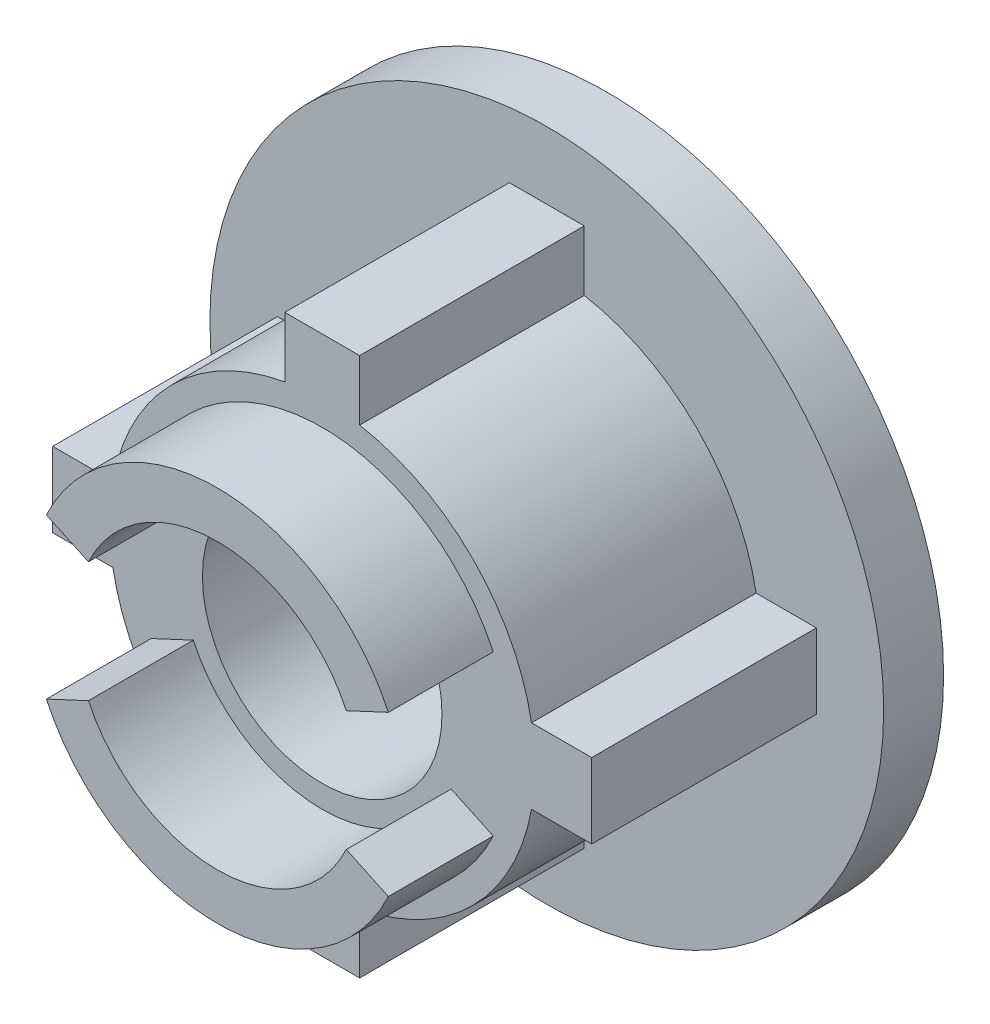
ISO-10303-21;
HEADER;
FILE_DESCRIPTION(('STEP AP214'),'2;1');
FILE_NAME('part.step','',(''),(''),'','','');
FILE_SCHEMA(('AUTOMOTIVE_DESIGN { 1 0 10303 214 1 1 1 1 }'));
ENDSEC;
DATA;
#1=APPLICATION_CONTEXT('core data for automotive mechanical design processes');
#2=APPLICATION_PROTOCOL_DEFINITION('international standard','automotive_design',2000,#1);
#3=PRODUCT_CONTEXT('',#1,'mechanical');
#4=PRODUCT('Part','Part','',(#3));
#5=PRODUCT_RELATED_PRODUCT_CATEGORY('part','',(#4));
#6=PRODUCT_DEFINITION_FORMATION('','',#4);
#7=PRODUCT_DEFINITION_CONTEXT('part definition',#1,'design');
#8=PRODUCT_DEFINITION('design','',#6,#7);
#9=PRODUCT_DEFINITION_SHAPE('','',#8);
#10=(LENGTH_UNIT() NAMED_UNIT(*) SI_UNIT(.MILLI.,.METRE.));
#11=(NAMED_UNIT(*) PLANE_ANGLE_UNIT() SI_UNIT($,.RADIAN.));
#12=(NAMED_UNIT(*) SI_UNIT($,.STERADIAN.) SOLID_ANGLE_UNIT());
#13=UNCERTAINTY_MEASURE_WITH_UNIT(LENGTH_MEASURE(1.E-05),#10,'distance_accuracy_value','');
#14=(GEOMETRIC_REPRESENTATION_CONTEXT(3) GLOBAL_UNCERTAINTY_ASSIGNED_CONTEXT((#13)) GLOBAL_UNIT_ASSIGNED_CONTEXT((#10,
#11,#12)) REPRESENTATION_CONTEXT('',''));
#15=CARTESIAN_POINT('',(0.,0.,0.));
#16=DIRECTION('',(0.,0.,1.));
#17=DIRECTION('',(1.,0.,0.));
#18=AXIS2_PLACEMENT_3D('',#15,#16,#17);
#19=CARTESIAN_POINT('',(0.,0.,15.));
#20=DIRECTION('',(0.,0.,1.));
#21=DIRECTION('',(1.,0.,0.));
#22=AXIS2_PLACEMENT_3D('',#19,#20,#21);
#23=PLANE('',#22);
#24=DIRECTION('',(0.,-1.,0.));
#25=VECTOR('',#24,1.);
#26=CARTESIAN_POINT('',(-2.50000000000001,0.,15.));
#27=LINE('',#26,#25);
#28=CARTESIAN_POINT('',(-2.50000000000001,18.,15.));
#29=VERTEX_POINT('',#28);
#30=CARTESIAN_POINT('',(-2.50000000000001,13.9781973086661,15.));
#31=VERTEX_POINT('',#30);
#32=EDGE_CURVE('E274',#29,#31,#27,.T.);
#33=ORIENTED_EDGE('',*,*,#32,.T.);
#34=CARTESIAN_POINT('',(0.,0.,15.));
#35=DIRECTION('',(0.,0.,1.));
#36=DIRECTION('',(1.,0.,0.));
#37=AXIS2_PLACEMENT_3D('',#34,#35,#36);
#38=CIRCLE('',#37,14.2);
#39=CARTESIAN_POINT('',(-13.9781973086661,2.49999999999995,15.));
#40=VERTEX_POINT('',#39);
#41=EDGE_CURVE('E277',#31,#40,#38,.T.);
#42=ORIENTED_EDGE('',*,*,#41,.T.);
#43=DIRECTION('',(-1.,0.,0.));
#44=VECTOR('',#43,1.);
#45=CARTESIAN_POINT('',(0.,2.49999999999995,15.));
#46=LINE('',#45,#44);
#47=CARTESIAN_POINT('',(-18.,2.49999999999995,15.));
#48=VERTEX_POINT('',#47);
#49=EDGE_CURVE('E280',#40,#48,#46,.T.);
#50=ORIENTED_EDGE('',*,*,#49,.T.);
#51=DIRECTION('',(0.,-1.,0.));
#52=VECTOR('',#51,1.);
#53=CARTESIAN_POINT('',(-18.,0.,15.));
#54=LINE('',#53,#52);
#55=CARTESIAN_POINT('',(-18.,-2.5,15.));
#56=VERTEX_POINT('',#55);
#57=EDGE_CURVE('E282',#48,#56,#54,.T.);
#58=ORIENTED_EDGE('',*,*,#57,.T.);
#59=DIRECTION('',(1.,0.,0.));
#60=VECTOR('',#59,1.);
#61=CARTESIAN_POINT('',(0.,-2.5,15.));
#62=LINE('',#61,#60);
#63=CARTESIAN_POINT('',(-13.9781973086661,-2.5,15.));
#64=VERTEX_POINT('',#63);
#65=EDGE_CURVE('E284',#56,#64,#62,.T.);
#66=ORIENTED_EDGE('',*,*,#65,.T.);
#67=CARTESIAN_POINT('',(0.,0.,15.));
#68=DIRECTION('',(0.,0.,1.));
#69=DIRECTION('',(1.,0.,0.));
#70=AXIS2_PLACEMENT_3D('',#67,#68,#69);
#71=CIRCLE('',#70,14.2);
#72=CARTESIAN_POINT('',(-2.5,-13.9781973086661,15.));
#73=VERTEX_POINT('',#72);
#74=EDGE_CURVE('E286',#64,#73,#71,.T.);
#75=ORIENTED_EDGE('',*,*,#74,.T.);
#76=DIRECTION('',(0.,-1.,0.));
#77=VECTOR('',#76,1.);
#78=CARTESIAN_POINT('',(-2.5,0.,15.));
#79=LINE('',#78,#77);
#80=CARTESIAN_POINT('',(-2.5,-18.,15.));
#81=VERTEX_POINT('',#80);
#82=EDGE_CURVE('E288',#73,#81,#79,.T.);
#83=ORIENTED_EDGE('',*,*,#82,.T.);
#84=DIRECTION('',(1.,0.,0.));
#85=VECTOR('',#84,1.);
#86=CARTESIAN_POINT('',(0.,-18.,15.));
#87=LINE('',#86,#85);
#88=CARTESIAN_POINT('',(2.5,-18.,15.));
#89=VERTEX_POINT('',#88);
#90=EDGE_CURVE('E290',#81,#89,#87,.T.);
#91=ORIENTED_EDGE('',*,*,#90,.T.);
#92=DIRECTION('',(0.,1.,0.));
#93=VECTOR('',#92,1.);
#94=CARTESIAN_POINT('',(2.5,0.,15.));
#95=LINE('',#94,#93);
#96=CARTESIAN_POINT('',(2.5,-13.9781973086661,15.));
#97=VERTEX_POINT('',#96);
#98=EDGE_CURVE('E292',#89,#97,#95,.T.);
#99=ORIENTED_EDGE('',*,*,#98,.T.);
#100=CARTESIAN_POINT('',(0.,0.,15.));
#101=DIRECTION('',(0.,0.,1.));
#102=DIRECTION('',(1.,0.,0.));
#103=AXIS2_PLACEMENT_3D('',#100,#101,#102);
#104=CIRCLE('',#103,14.2);
#105=CARTESIAN_POINT('',(13.9781973086661,-2.49999999999995,15.));
#106=VERTEX_POINT('',#105);
#107=EDGE_CURVE('E294',#97,#106,#104,.T.);
#108=ORIENTED_EDGE('',*,*,#107,.T.);
#109=DIRECTION('',(1.,0.,0.));
#110=VECTOR('',#109,1.);
#111=CARTESIAN_POINT('',(0.,-2.49999999999995,15.));
#112=LINE('',#111,#110);
#113=CARTESIAN_POINT('',(18.,-2.49999999999995,15.));
#114=VERTEX_POINT('',#113);
#115=EDGE_CURVE('E296',#106,#114,#112,.T.);
#116=ORIENTED_EDGE('',*,*,#115,.T.);
#117=DIRECTION('',(0.,1.,0.));
#118=VECTOR('',#117,1.);
#119=CARTESIAN_POINT('',(18.,0.,15.));
#120=LINE('',#119,#118);
#121=CARTESIAN_POINT('',(18.,2.5,15.));
#122=VERTEX_POINT('',#121);
#123=EDGE_CURVE('E298',#114,#122,#120,.T.);
#124=ORIENTED_EDGE('',*,*,#123,.T.);
#125=DIRECTION('',(-1.,0.,0.));
#126=VECTOR('',#125,1.);
#127=CARTESIAN_POINT('',(0.,2.5,15.));
#128=LINE('',#127,#126);
#129=CARTESIAN_POINT('',(13.9781973086661,2.5,15.));
#130=VERTEX_POINT('',#129);
#131=EDGE_CURVE('E300',#122,#130,#128,.T.);
#132=ORIENTED_EDGE('',*,*,#131,.T.);
#133=CARTESIAN_POINT('',(0.,0.,15.));
#134=DIRECTION('',(0.,0.,1.));
#135=DIRECTION('',(1.,0.,0.));
#136=AXIS2_PLACEMENT_3D('',#133,#134,#135);
#137=CIRCLE('',#136,14.2);
#138=CARTESIAN_POINT('',(2.5,13.9781973086661,15.));
#139=VERTEX_POINT('',#138);
#140=EDGE_CURVE('E302',#130,#139,#137,.T.);
#141=ORIENTED_EDGE('',*,*,#140,.T.);
#142=DIRECTION('',(0.,1.,0.));
#143=VECTOR('',#142,1.);
#144=CARTESIAN_POINT('',(2.5,0.,15.));
#145=LINE('',#144,#143);
#146=CARTESIAN_POINT('',(2.5,18.,15.));
#147=VERTEX_POINT('',#146);
#148=EDGE_CURVE('E304',#139,#147,#145,.T.);
#149=ORIENTED_EDGE('',*,*,#148,.T.);
#150=DIRECTION('',(-1.,0.,0.));
#151=VECTOR('',#150,1.);
#152=CARTESIAN_POINT('',(0.,18.,15.));
#153=LINE('',#152,#151);
#154=EDGE_CURVE('E306',#147,#29,#153,.T.);
#155=ORIENTED_EDGE('',*,*,#154,.T.);
#156=EDGE_LOOP('',(#33,#42,#50,#58,#66,#75,#83,#91,#99,#108,#116,#124,#132,#141,#149,#155));
#157=FACE_BOUND('',#156,.T.);
#158=CARTESIAN_POINT('',(0.,0.,15.));
#159=DIRECTION('',(0.,0.,1.));
#160=DIRECTION('',(1.,0.,0.));
#161=AXIS2_PLACEMENT_3D('',#158,#159,#160);
#162=CIRCLE('',#161,8.);
#163=CARTESIAN_POINT('',(8.,0.,15.));
#164=VERTEX_POINT('',#163);
#165=EDGE_CURVE('E239',#164,#164,#162,.T.);
#166=ORIENTED_EDGE('',*,*,#165,.F.);
#167=EDGE_LOOP('',(#166));
#168=FACE_BOUND('',#167,.T.);
#169=DIRECTION('',(0.906307787036649,0.422618261740701,0.));
#170=VECTOR('',#169,1.);
#171=CARTESIAN_POINT('',(8.60992397684817,4.01487348653666,15.));
#172=LINE('',#171,#170);
#173=CARTESIAN_POINT('',(8.60992397684817,4.01487348653666,15.));
#174=VERTEX_POINT('',#173);
#175=CARTESIAN_POINT('',(11.4194781166618,5.32499009793283,15.));
#176=VERTEX_POINT('',#175);
#177=EDGE_CURVE('E259',#174,#176,#172,.T.);
#178=ORIENTED_EDGE('',*,*,#177,.F.);
#179=CARTESIAN_POINT('',(0.,0.,15.));
#180=DIRECTION('',(0.,0.,-1.));
#181=DIRECTION('',(1.,0.,0.));
#182=AXIS2_PLACEMENT_3D('',#179,#180,#181);
#183=CIRCLE('',#182,9.5);
#184=CARTESIAN_POINT('',(-8.60992397684817,4.01487348653666,15.));
#185=VERTEX_POINT('',#184);
#186=EDGE_CURVE('E261',#185,#174,#183,.T.);
#187=ORIENTED_EDGE('',*,*,#186,.F.);
#188=DIRECTION('',(0.906307787036649,-0.4226182617407,0.));
#189=VECTOR('',#188,1.);
#190=CARTESIAN_POINT('',(-11.4194781166618,5.32499009793283,15.));
#191=LINE('',#190,#189);
#192=CARTESIAN_POINT('',(-11.4194781166618,5.32499009793283,15.));
#193=VERTEX_POINT('',#192);
#194=EDGE_CURVE('E254',#193,#185,#191,.T.);
#195=ORIENTED_EDGE('',*,*,#194,.F.);
#196=CARTESIAN_POINT('',(0.,0.,15.));
#197=DIRECTION('',(0.,0.,1.));
#198=DIRECTION('',(1.,0.,0.));
#199=AXIS2_PLACEMENT_3D('',#196,#197,#198);
#200=CIRCLE('',#199,12.6);
#201=EDGE_CURVE('E256',#176,#193,#200,.T.);
#202=ORIENTED_EDGE('',*,*,#201,.F.);
#203=EDGE_LOOP('',(#178,#187,#195,#202));
#204=FACE_BOUND('',#203,.T.);
#205=DIRECTION('',(-0.906307787036649,0.422618261740701,0.));
#206=VECTOR('',#205,1.);
#207=CARTESIAN_POINT('',(8.60992397684817,-4.01487348653666,15.));
#208=LINE('',#207,#206);
#209=CARTESIAN_POINT('',(11.4194781166618,-5.32499009793283,15.));
#210=VERTEX_POINT('',#209);
#211=CARTESIAN_POINT('',(8.60992397684817,-4.01487348653666,15.));
#212=VERTEX_POINT('',#211);
#213=EDGE_CURVE('E710',#210,#212,#208,.T.);
#214=ORIENTED_EDGE('',*,*,#213,.F.);
#215=CARTESIAN_POINT('',(0.,0.,15.));
#216=DIRECTION('',(0.,0.,1.));
#217=DIRECTION('',(1.,0.,0.));
#218=AXIS2_PLACEMENT_3D('',#215,#216,#217);
#219=CIRCLE('',#218,12.6);
#220=CARTESIAN_POINT('',(-11.4194781166618,-5.32499009793283,15.));
#221=VERTEX_POINT('',#220);
#222=EDGE_CURVE('E234',#221,#210,#219,.T.);
#223=ORIENTED_EDGE('',*,*,#222,.F.);
#224=DIRECTION('',(-0.906307787036649,-0.422618261740701,0.));
#225=VECTOR('',#224,1.);
#226=CARTESIAN_POINT('',(-11.4194781166618,-5.32499009793283,15.));
#227=LINE('',#226,#225);
#228=CARTESIAN_POINT('',(-8.60992397684817,-4.01487348653666,15.));
#229=VERTEX_POINT('',#228);
#230=EDGE_CURVE('E230',#229,#221,#227,.T.);
#231=ORIENTED_EDGE('',*,*,#230,.F.);
#232=CARTESIAN_POINT('',(0.,0.,15.));
#233=DIRECTION('',(0.,0.,-1.));
#234=DIRECTION('',(1.,0.,0.));
#235=AXIS2_PLACEMENT_3D('',#232,#233,#234);
#236=CIRCLE('',#235,9.5);
#237=EDGE_CURVE('E707',#212,#229,#236,.T.);
#238=ORIENTED_EDGE('',*,*,#237,.F.);
#239=EDGE_LOOP('',(#214,#223,#231,#238));
#240=FACE_BOUND('',#239,.T.);
#241=ADVANCED_FACE('F49',(#157,#168,#204,#240),#23,.T.);
#242=CARTESIAN_POINT('',(0.,0.,0.));
#243=DIRECTION('',(0.,0.,-1.));
#244=DIRECTION('',(-1.,0.,0.));
#245=AXIS2_PLACEMENT_3D('',#242,#243,#244);
#246=PLANE('',#245);
#247=CARTESIAN_POINT('',(0.,0.,0.));
#248=DIRECTION('',(0.,0.,-1.));
#249=DIRECTION('',(-1.,0.,0.));
#250=AXIS2_PLACEMENT_3D('',#247,#248,#249);
#251=CIRCLE('',#250,22.5);
#252=CARTESIAN_POINT('',(-22.5,0.,0.));
#253=VERTEX_POINT('',#252);
#254=EDGE_CURVE('E405',#253,#253,#251,.T.);
#255=ORIENTED_EDGE('',*,*,#254,.F.);
#256=EDGE_LOOP('',(#255));
#257=FACE_BOUND('',#256,.T.);
#258=DIRECTION('',(0.,-1.,0.));
#259=VECTOR('',#258,1.);
#260=CARTESIAN_POINT('',(-2.50000000000001,0.,0.));
#261=LINE('',#260,#259);
#262=CARTESIAN_POINT('',(-2.50000000000001,18.,0.));
#263=VERTEX_POINT('',#262);
#264=CARTESIAN_POINT('',(-2.50000000000001,13.9781973086661,0.));
#265=VERTEX_POINT('',#264);
#266=EDGE_CURVE('E273',#263,#265,#261,.T.);
#267=ORIENTED_EDGE('',*,*,#266,.F.);
#268=DIRECTION('',(-1.,0.,0.));
#269=VECTOR('',#268,1.);
#270=CARTESIAN_POINT('',(0.,18.,0.));
#271=LINE('',#270,#269);
#272=CARTESIAN_POINT('',(2.5,18.,0.));
#273=VERTEX_POINT('',#272);
#274=EDGE_CURVE('E278',#273,#263,#271,.T.);
#275=ORIENTED_EDGE('',*,*,#274,.F.);
#276=DIRECTION('',(0.,1.,0.));
#277=VECTOR('',#276,1.);
#278=CARTESIAN_POINT('',(2.5,0.,0.));
#279=LINE('',#278,#277);
#280=CARTESIAN_POINT('',(2.5,13.9781973086661,0.));
#281=VERTEX_POINT('',#280);
#282=EDGE_CURVE('E350',#281,#273,#279,.T.);
#283=ORIENTED_EDGE('',*,*,#282,.F.);
#284=CARTESIAN_POINT('',(0.,0.,0.));
#285=DIRECTION('',(0.,0.,1.));
#286=DIRECTION('',(1.,0.,0.));
#287=AXIS2_PLACEMENT_3D('',#284,#285,#286);
#288=CIRCLE('',#287,14.2);
#289=CARTESIAN_POINT('',(13.9781973086661,2.5,0.));
#290=VERTEX_POINT('',#289);
#291=EDGE_CURVE('E347',#290,#281,#288,.T.);
#292=ORIENTED_EDGE('',*,*,#291,.F.);
#293=DIRECTION('',(-1.,0.,0.));
#294=VECTOR('',#293,1.);
#295=CARTESIAN_POINT('',(0.,2.5,0.));
#296=LINE('',#295,#294);
#297=CARTESIAN_POINT('',(18.,2.5,0.));
#298=VERTEX_POINT('',#297);
#299=EDGE_CURVE('E344',#298,#290,#296,.T.);
#300=ORIENTED_EDGE('',*,*,#299,.F.);
#301=DIRECTION('',(0.,1.,0.));
#302=VECTOR('',#301,1.);
#303=CARTESIAN_POINT('',(18.,0.,0.));
#304=LINE('',#303,#302);
#305=CARTESIAN_POINT('',(18.,-2.49999999999995,0.));
#306=VERTEX_POINT('',#305);
#307=EDGE_CURVE('E341',#306,#298,#304,.T.);
#308=ORIENTED_EDGE('',*,*,#307,.F.);
#309=DIRECTION('',(1.,0.,0.));
#310=VECTOR('',#309,1.);
#311=CARTESIAN_POINT('',(0.,-2.49999999999995,0.));
#312=LINE('',#311,#310);
#313=CARTESIAN_POINT('',(13.9781973086661,-2.49999999999995,0.));
#314=VERTEX_POINT('',#313);
#315=EDGE_CURVE('E338',#314,#306,#312,.T.);
#316=ORIENTED_EDGE('',*,*,#315,.F.);
#317=CARTESIAN_POINT('',(0.,0.,0.));
#318=DIRECTION('',(0.,0.,1.));
#319=DIRECTION('',(1.,0.,0.));
#320=AXIS2_PLACEMENT_3D('',#317,#318,#319);
#321=CIRCLE('',#320,14.2);
#322=CARTESIAN_POINT('',(2.5,-13.9781973086661,0.));
#323=VERTEX_POINT('',#322);
#324=EDGE_CURVE('E335',#323,#314,#321,.T.);
#325=ORIENTED_EDGE('',*,*,#324,.F.);
#326=DIRECTION('',(0.,1.,0.));
#327=VECTOR('',#326,1.);
#328=CARTESIAN_POINT('',(2.5,0.,0.));
#329=LINE('',#328,#327);
#330=CARTESIAN_POINT('',(2.5,-18.,0.));
#331=VERTEX_POINT('',#330);
#332=EDGE_CURVE('E332',#331,#323,#329,.T.);
#333=ORIENTED_EDGE('',*,*,#332,.F.);
#334=DIRECTION('',(1.,0.,0.));
#335=VECTOR('',#334,1.);
#336=CARTESIAN_POINT('',(0.,-18.,0.));
#337=LINE('',#336,#335);
#338=CARTESIAN_POINT('',(-2.5,-18.,0.));
#339=VERTEX_POINT('',#338);
#340=EDGE_CURVE('E329',#339,#331,#337,.T.);
#341=ORIENTED_EDGE('',*,*,#340,.F.);
#342=DIRECTION('',(0.,-1.,0.));
#343=VECTOR('',#342,1.);
#344=CARTESIAN_POINT('',(-2.5,0.,0.));
#345=LINE('',#344,#343);
#346=CARTESIAN_POINT('',(-2.5,-13.9781973086661,0.));
#347=VERTEX_POINT('',#346);
#348=EDGE_CURVE('E326',#347,#339,#345,.T.);
#349=ORIENTED_EDGE('',*,*,#348,.F.);
#350=CARTESIAN_POINT('',(0.,0.,0.));
#351=DIRECTION('',(0.,0.,1.));
#352=DIRECTION('',(1.,0.,0.));
#353=AXIS2_PLACEMENT_3D('',#350,#351,#352);
#354=CIRCLE('',#353,14.2);
#355=CARTESIAN_POINT('',(-13.9781973086661,-2.5,0.));
#356=VERTEX_POINT('',#355);
#357=EDGE_CURVE('E323',#356,#347,#354,.T.);
#358=ORIENTED_EDGE('',*,*,#357,.F.);
#359=DIRECTION('',(1.,0.,0.));
#360=VECTOR('',#359,1.);
#361=CARTESIAN_POINT('',(0.,-2.5,0.));
#362=LINE('',#361,#360);
#363=CARTESIAN_POINT('',(-18.,-2.5,0.));
#364=VERTEX_POINT('',#363);
#365=EDGE_CURVE('E320',#364,#356,#362,.T.);
#366=ORIENTED_EDGE('',*,*,#365,.F.);
#367=DIRECTION('',(0.,-1.,0.));
#368=VECTOR('',#367,1.);
#369=CARTESIAN_POINT('',(-18.,0.,0.));
#370=LINE('',#369,#368);
#371=CARTESIAN_POINT('',(-18.,2.49999999999995,0.));
#372=VERTEX_POINT('',#371);
#373=EDGE_CURVE('E317',#372,#364,#370,.T.);
#374=ORIENTED_EDGE('',*,*,#373,.F.);
#375=DIRECTION('',(-1.,0.,0.));
#376=VECTOR('',#375,1.);
#377=CARTESIAN_POINT('',(0.,2.49999999999995,0.));
#378=LINE('',#377,#376);
#379=CARTESIAN_POINT('',(-13.9781973086661,2.49999999999995,0.));
#380=VERTEX_POINT('',#379);
#381=EDGE_CURVE('E314',#380,#372,#378,.T.);
#382=ORIENTED_EDGE('',*,*,#381,.F.);
#383=CARTESIAN_POINT('',(0.,0.,0.));
#384=DIRECTION('',(0.,0.,1.));
#385=DIRECTION('',(1.,0.,0.));
#386=AXIS2_PLACEMENT_3D('',#383,#384,#385);
#387=CIRCLE('',#386,14.2);
#388=EDGE_CURVE('E311',#265,#380,#387,.T.);
#389=ORIENTED_EDGE('',*,*,#388,.F.);
#390=EDGE_LOOP('',(#267,#275,#283,#292,#300,#308,#316,#325,#333,#341,#349,#358,#366,#374,#382,#389));
#391=FACE_BOUND('',#390,.T.);
#392=ADVANCED_FACE('F411',(#257,#391),#246,.F.);
#393=CARTESIAN_POINT('',(0.,0.,-4.));
#394=DIRECTION('',(0.,0.,1.));
#395=DIRECTION('',(1.,0.,0.));
#396=AXIS2_PLACEMENT_3D('',#393,#394,#395);
#397=CYLINDRICAL_SURFACE('',#396,22.5);
#398=CARTESIAN_POINT('',(0.,0.,-4.));
#399=DIRECTION('',(0.,0.,-1.));
#400=DIRECTION('',(-1.,0.,0.));
#401=AXIS2_PLACEMENT_3D('',#398,#399,#400);
#402=CIRCLE('',#401,22.5);
#403=CARTESIAN_POINT('',(-22.5,0.,-4.));
#404=VERTEX_POINT('',#403);
#405=EDGE_CURVE('E57',#404,#404,#402,.T.);
#406=ORIENTED_EDGE('',*,*,#405,.F.);
#407=EDGE_LOOP('',(#406));
#408=FACE_BOUND('',#407,.T.);
#409=ORIENTED_EDGE('',*,*,#254,.T.);
#410=EDGE_LOOP('',(#409));
#411=FACE_BOUND('',#410,.T.);
#412=ADVANCED_FACE('F51',(#408,#411),#397,.T.);
#413=CARTESIAN_POINT('',(0.,0.,-4.));
#414=DIRECTION('',(0.,0.,-1.));
#415=DIRECTION('',(-1.,0.,0.));
#416=AXIS2_PLACEMENT_3D('',#413,#414,#415);
#417=PLANE('',#416);
#418=ORIENTED_EDGE('',*,*,#405,.T.);
#419=EDGE_LOOP('',(#418));
#420=FACE_BOUND('',#419,.T.);
#421=CARTESIAN_POINT('',(0.,0.,-4.));
#422=DIRECTION('',(0.,0.,-1.));
#423=DIRECTION('',(-1.,0.,0.));
#424=AXIS2_PLACEMENT_3D('',#421,#422,#423);
#425=CIRCLE('',#424,11.15);
#426=CARTESIAN_POINT('',(-11.15,0.,-4.));
#427=VERTEX_POINT('',#426);
#428=EDGE_CURVE('E402',#427,#427,#425,.T.);
#429=ORIENTED_EDGE('',*,*,#428,.F.);
#430=EDGE_LOOP('',(#429));
#431=FACE_BOUND('',#430,.T.);
#432=ADVANCED_FACE('F582',(#420,#431),#417,.T.);
#433=CARTESIAN_POINT('',(0.,0.,-44.1636651713959));
#434=DIRECTION('',(0.,0.,1.));
#435=DIRECTION('',(1.,0.,0.));
#436=AXIS2_PLACEMENT_3D('',#433,#434,#435);
#437=CYLINDRICAL_SURFACE('',#436,11.15);
#438=CARTESIAN_POINT('',(0.,0.,3.));
#439=DIRECTION('',(0.,0.,-1.));
#440=DIRECTION('',(-1.,0.,0.));
#441=AXIS2_PLACEMENT_3D('',#438,#439,#440);
#442=CIRCLE('',#441,11.15);
#443=CARTESIAN_POINT('',(-11.15,0.,3.));
#444=VERTEX_POINT('',#443);
#445=EDGE_CURVE('E11',#444,#444,#442,.T.);
#446=ORIENTED_EDGE('',*,*,#445,.F.);
#447=EDGE_LOOP('',(#446));
#448=FACE_BOUND('',#447,.T.);
#449=ORIENTED_EDGE('',*,*,#428,.T.);
#450=EDGE_LOOP('',(#449));
#451=FACE_BOUND('',#450,.T.);
#452=ADVANCED_FACE('F486',(#448,#451),#437,.F.);
#453=CARTESIAN_POINT('',(-2.50000000000001,0.,15.));
#454=DIRECTION('',(1.,0.,0.));
#455=DIRECTION('',(0.,0.,-1.));
#456=AXIS2_PLACEMENT_3D('',#453,#454,#455);
#457=PLANE('',#456);
#458=ORIENTED_EDGE('',*,*,#266,.T.);
#459=DIRECTION('',(0.,0.,-1.));
#460=VECTOR('',#459,1.);
#461=CARTESIAN_POINT('',(-2.50000000000001,13.9781973086661,15.));
#462=LINE('',#461,#460);
#463=EDGE_CURVE('E399',#31,#265,#462,.T.);
#464=ORIENTED_EDGE('',*,*,#463,.F.);
#465=ORIENTED_EDGE('',*,*,#32,.F.);
#466=DIRECTION('',(0.,0.,-1.));
#467=VECTOR('',#466,1.);
#468=CARTESIAN_POINT('',(-2.50000000000001,18.,15.));
#469=LINE('',#468,#467);
#470=EDGE_CURVE('E308',#29,#263,#469,.T.);
#471=ORIENTED_EDGE('',*,*,#470,.T.);
#472=EDGE_LOOP('',(#458,#464,#465,#471));
#473=FACE_BOUND('',#472,.T.);
#474=ADVANCED_FACE('F422',(#473),#457,.F.);
#475=CARTESIAN_POINT('',(0.,0.,15.));
#476=DIRECTION('',(0.,0.,-1.));
#477=DIRECTION('',(-1.,0.,0.));
#478=AXIS2_PLACEMENT_3D('',#475,#476,#477);
#479=CYLINDRICAL_SURFACE('',#478,14.2);
#480=ORIENTED_EDGE('',*,*,#388,.T.);
#481=DIRECTION('',(0.,0.,-1.));
#482=VECTOR('',#481,1.);
#483=CARTESIAN_POINT('',(-13.9781973086661,2.49999999999995,15.));
#484=LINE('',#483,#482);
#485=EDGE_CURVE('E396',#40,#380,#484,.T.);
#486=ORIENTED_EDGE('',*,*,#485,.F.);
#487=ORIENTED_EDGE('',*,*,#41,.F.);
#488=ORIENTED_EDGE('',*,*,#463,.T.);
#489=EDGE_LOOP('',(#480,#486,#487,#488));
#490=FACE_BOUND('',#489,.T.);
#491=ADVANCED_FACE('F478',(#490),#479,.T.);
#492=CARTESIAN_POINT('',(0.,2.49999999999995,15.));
#493=DIRECTION('',(0.,-1.,0.));
#494=DIRECTION('',(0.,0.,-1.));
#495=AXIS2_PLACEMENT_3D('',#492,#493,#494);
#496=PLANE('',#495);
#497=ORIENTED_EDGE('',*,*,#381,.T.);
#498=DIRECTION('',(0.,0.,-1.));
#499=VECTOR('',#498,1.);
#500=CARTESIAN_POINT('',(-18.,2.49999999999995,15.));
#501=LINE('',#500,#499);
#502=EDGE_CURVE('E393',#48,#372,#501,.T.);
#503=ORIENTED_EDGE('',*,*,#502,.F.);
#504=ORIENTED_EDGE('',*,*,#49,.F.);
#505=ORIENTED_EDGE('',*,*,#485,.T.);
#506=EDGE_LOOP('',(#497,#503,#504,#505));
#507=FACE_BOUND('',#506,.T.);
#508=ADVANCED_FACE('F476',(#507),#496,.F.);
#509=CARTESIAN_POINT('',(-18.,0.,15.));
#510=DIRECTION('',(1.,0.,0.));
#511=DIRECTION('',(0.,0.,-1.));
#512=AXIS2_PLACEMENT_3D('',#509,#510,#511);
#513=PLANE('',#512);
#514=ORIENTED_EDGE('',*,*,#373,.T.);
#515=DIRECTION('',(0.,0.,-1.));
#516=VECTOR('',#515,1.);
#517=CARTESIAN_POINT('',(-18.,-2.5,15.));
#518=LINE('',#517,#516);
#519=EDGE_CURVE('E390',#56,#364,#518,.T.);
#520=ORIENTED_EDGE('',*,*,#519,.F.);
#521=ORIENTED_EDGE('',*,*,#57,.F.);
#522=ORIENTED_EDGE('',*,*,#502,.T.);
#523=EDGE_LOOP('',(#514,#520,#521,#522));
#524=FACE_BOUND('',#523,.T.);
#525=ADVANCED_FACE('F471',(#524),#513,.F.);
#526=CARTESIAN_POINT('',(0.,-2.5,15.));
#527=DIRECTION('',(0.,1.,0.));
#528=DIRECTION('',(0.,0.,1.));
#529=AXIS2_PLACEMENT_3D('',#526,#527,#528);
#530=PLANE('',#529);
#531=ORIENTED_EDGE('',*,*,#365,.T.);
#532=DIRECTION('',(0.,0.,-1.));
#533=VECTOR('',#532,1.);
#534=CARTESIAN_POINT('',(-13.9781973086661,-2.5,15.));
#535=LINE('',#534,#533);
#536=EDGE_CURVE('E387',#64,#356,#535,.T.);
#537=ORIENTED_EDGE('',*,*,#536,.F.);
#538=ORIENTED_EDGE('',*,*,#65,.F.);
#539=ORIENTED_EDGE('',*,*,#519,.T.);
#540=EDGE_LOOP('',(#531,#537,#538,#539));
#541=FACE_BOUND('',#540,.T.);
#542=ADVANCED_FACE('F468',(#541),#530,.F.);
#543=CARTESIAN_POINT('',(0.,0.,15.));
#544=DIRECTION('',(0.,0.,-1.));
#545=DIRECTION('',(-1.,0.,0.));
#546=AXIS2_PLACEMENT_3D('',#543,#544,#545);
#547=CYLINDRICAL_SURFACE('',#546,14.2);
#548=ORIENTED_EDGE('',*,*,#357,.T.);
#549=DIRECTION('',(0.,0.,-1.));
#550=VECTOR('',#549,1.);
#551=CARTESIAN_POINT('',(-2.5,-13.9781973086661,15.));
#552=LINE('',#551,#550);
#553=EDGE_CURVE('E384',#73,#347,#552,.T.);
#554=ORIENTED_EDGE('',*,*,#553,.F.);
#555=ORIENTED_EDGE('',*,*,#74,.F.);
#556=ORIENTED_EDGE('',*,*,#536,.T.);
#557=EDGE_LOOP('',(#548,#554,#555,#556));
#558=FACE_BOUND('',#557,.T.);
#559=ADVANCED_FACE('F463',(#558),#547,.T.);
#560=CARTESIAN_POINT('',(-2.5,0.,15.));
#561=DIRECTION('',(1.,0.,0.));
#562=DIRECTION('',(0.,0.,-1.));
#563=AXIS2_PLACEMENT_3D('',#560,#561,#562);
#564=PLANE('',#563);
#565=ORIENTED_EDGE('',*,*,#348,.T.);
#566=DIRECTION('',(0.,0.,-1.));
#567=VECTOR('',#566,1.);
#568=CARTESIAN_POINT('',(-2.5,-18.,15.));
#569=LINE('',#568,#567);
#570=EDGE_CURVE('E381',#81,#339,#569,.T.);
#571=ORIENTED_EDGE('',*,*,#570,.F.);
#572=ORIENTED_EDGE('',*,*,#82,.F.);
#573=ORIENTED_EDGE('',*,*,#553,.T.);
#574=EDGE_LOOP('',(#565,#571,#572,#573));
#575=FACE_BOUND('',#574,.T.);
#576=ADVANCED_FACE('F460',(#575),#564,.F.);
#577=CARTESIAN_POINT('',(0.,-18.,15.));
#578=DIRECTION('',(0.,1.,0.));
#579=DIRECTION('',(0.,0.,1.));
#580=AXIS2_PLACEMENT_3D('',#577,#578,#579);
#581=PLANE('',#580);
#582=ORIENTED_EDGE('',*,*,#340,.T.);
#583=DIRECTION('',(0.,0.,-1.));
#584=VECTOR('',#583,1.);
#585=CARTESIAN_POINT('',(2.5,-18.,15.));
#586=LINE('',#585,#584);
#587=EDGE_CURVE('E378',#89,#331,#586,.T.);
#588=ORIENTED_EDGE('',*,*,#587,.F.);
#589=ORIENTED_EDGE('',*,*,#90,.F.);
#590=ORIENTED_EDGE('',*,*,#570,.T.);
#591=EDGE_LOOP('',(#582,#588,#589,#590));
#592=FACE_BOUND('',#591,.T.);
#593=ADVANCED_FACE('F455',(#592),#581,.F.);
#594=CARTESIAN_POINT('',(2.5,0.,15.));
#595=DIRECTION('',(-1.,0.,0.));
#596=DIRECTION('',(0.,0.,1.));
#597=AXIS2_PLACEMENT_3D('',#594,#595,#596);
#598=PLANE('',#597);
#599=ORIENTED_EDGE('',*,*,#332,.T.);
#600=DIRECTION('',(0.,0.,-1.));
#601=VECTOR('',#600,1.);
#602=CARTESIAN_POINT('',(2.5,-13.9781973086661,15.));
#603=LINE('',#602,#601);
#604=EDGE_CURVE('E375',#97,#323,#603,.T.);
#605=ORIENTED_EDGE('',*,*,#604,.F.);
#606=ORIENTED_EDGE('',*,*,#98,.F.);
#607=ORIENTED_EDGE('',*,*,#587,.T.);
#608=EDGE_LOOP('',(#599,#605,#606,#607));
#609=FACE_BOUND('',#608,.T.);
#610=ADVANCED_FACE('F452',(#609),#598,.F.);
#611=CARTESIAN_POINT('',(0.,0.,15.));
#612=DIRECTION('',(0.,0.,-1.));
#613=DIRECTION('',(-1.,0.,0.));
#614=AXIS2_PLACEMENT_3D('',#611,#612,#613);
#615=CYLINDRICAL_SURFACE('',#614,14.2);
#616=ORIENTED_EDGE('',*,*,#324,.T.);
#617=DIRECTION('',(0.,0.,-1.));
#618=VECTOR('',#617,1.);
#619=CARTESIAN_POINT('',(13.9781973086661,-2.49999999999995,15.));
#620=LINE('',#619,#618);
#621=EDGE_CURVE('E372',#106,#314,#620,.T.);
#622=ORIENTED_EDGE('',*,*,#621,.F.);
#623=ORIENTED_EDGE('',*,*,#107,.F.);
#624=ORIENTED_EDGE('',*,*,#604,.T.);
#625=EDGE_LOOP('',(#616,#622,#623,#624));
#626=FACE_BOUND('',#625,.T.);
#627=ADVANCED_FACE('F447',(#626),#615,.T.);
#628=CARTESIAN_POINT('',(0.,-2.49999999999995,15.));
#629=DIRECTION('',(0.,1.,0.));
#630=DIRECTION('',(0.,0.,1.));
#631=AXIS2_PLACEMENT_3D('',#628,#629,#630);
#632=PLANE('',#631);
#633=ORIENTED_EDGE('',*,*,#315,.T.);
#634=DIRECTION('',(0.,0.,-1.));
#635=VECTOR('',#634,1.);
#636=CARTESIAN_POINT('',(18.,-2.49999999999995,15.));
#637=LINE('',#636,#635);
#638=EDGE_CURVE('E369',#114,#306,#637,.T.);
#639=ORIENTED_EDGE('',*,*,#638,.F.);
#640=ORIENTED_EDGE('',*,*,#115,.F.);
#641=ORIENTED_EDGE('',*,*,#621,.T.);
#642=EDGE_LOOP('',(#633,#639,#640,#641));
#643=FACE_BOUND('',#642,.T.);
#644=ADVANCED_FACE('F444',(#643),#632,.F.);
#645=CARTESIAN_POINT('',(18.,0.,15.));
#646=DIRECTION('',(-1.,0.,0.));
#647=DIRECTION('',(0.,0.,1.));
#648=AXIS2_PLACEMENT_3D('',#645,#646,#647);
#649=PLANE('',#648);
#650=ORIENTED_EDGE('',*,*,#307,.T.);
#651=DIRECTION('',(0.,0.,-1.));
#652=VECTOR('',#651,1.);
#653=CARTESIAN_POINT('',(18.,2.5,15.));
#654=LINE('',#653,#652);
#655=EDGE_CURVE('E366',#122,#298,#654,.T.);
#656=ORIENTED_EDGE('',*,*,#655,.F.);
#657=ORIENTED_EDGE('',*,*,#123,.F.);
#658=ORIENTED_EDGE('',*,*,#638,.T.);
#659=EDGE_LOOP('',(#650,#656,#657,#658));
#660=FACE_BOUND('',#659,.T.);
#661=ADVANCED_FACE('F439',(#660),#649,.F.);
#662=CARTESIAN_POINT('',(0.,2.5,15.));
#663=DIRECTION('',(0.,-1.,0.));
#664=DIRECTION('',(0.,0.,-1.));
#665=AXIS2_PLACEMENT_3D('',#662,#663,#664);
#666=PLANE('',#665);
#667=ORIENTED_EDGE('',*,*,#299,.T.);
#668=DIRECTION('',(0.,0.,-1.));
#669=VECTOR('',#668,1.);
#670=CARTESIAN_POINT('',(13.9781973086661,2.5,15.));
#671=LINE('',#670,#669);
#672=EDGE_CURVE('E363',#130,#290,#671,.T.);
#673=ORIENTED_EDGE('',*,*,#672,.F.);
#674=ORIENTED_EDGE('',*,*,#131,.F.);
#675=ORIENTED_EDGE('',*,*,#655,.T.);
#676=EDGE_LOOP('',(#667,#673,#674,#675));
#677=FACE_BOUND('',#676,.T.);
#678=ADVANCED_FACE('F436',(#677),#666,.F.);
#679=CARTESIAN_POINT('',(0.,0.,15.));
#680=DIRECTION('',(0.,0.,-1.));
#681=DIRECTION('',(-1.,0.,0.));
#682=AXIS2_PLACEMENT_3D('',#679,#680,#681);
#683=CYLINDRICAL_SURFACE('',#682,14.2);
#684=ORIENTED_EDGE('',*,*,#291,.T.);
#685=DIRECTION('',(0.,0.,-1.));
#686=VECTOR('',#685,1.);
#687=CARTESIAN_POINT('',(2.5,13.9781973086661,15.));
#688=LINE('',#687,#686);
#689=EDGE_CURVE('E360',#139,#281,#688,.T.);
#690=ORIENTED_EDGE('',*,*,#689,.F.);
#691=ORIENTED_EDGE('',*,*,#140,.F.);
#692=ORIENTED_EDGE('',*,*,#672,.T.);
#693=EDGE_LOOP('',(#684,#690,#691,#692));
#694=FACE_BOUND('',#693,.T.);
#695=ADVANCED_FACE('F432',(#694),#683,.T.);
#696=CARTESIAN_POINT('',(2.5,0.,15.));
#697=DIRECTION('',(-1.,0.,0.));
#698=DIRECTION('',(0.,0.,1.));
#699=AXIS2_PLACEMENT_3D('',#696,#697,#698);
#700=PLANE('',#699);
#701=ORIENTED_EDGE('',*,*,#282,.T.);
#702=DIRECTION('',(0.,0.,-1.));
#703=VECTOR('',#702,1.);
#704=CARTESIAN_POINT('',(2.5,18.,15.));
#705=LINE('',#704,#703);
#706=EDGE_CURVE('E357',#147,#273,#705,.T.);
#707=ORIENTED_EDGE('',*,*,#706,.F.);
#708=ORIENTED_EDGE('',*,*,#148,.F.);
#709=ORIENTED_EDGE('',*,*,#689,.T.);
#710=EDGE_LOOP('',(#701,#707,#708,#709));
#711=FACE_BOUND('',#710,.T.);
#712=ADVANCED_FACE('F430',(#711),#700,.F.);
#713=CARTESIAN_POINT('',(0.,18.,15.));
#714=DIRECTION('',(0.,-1.,0.));
#715=DIRECTION('',(0.,0.,-1.));
#716=AXIS2_PLACEMENT_3D('',#713,#714,#715);
#717=PLANE('',#716);
#718=ORIENTED_EDGE('',*,*,#274,.T.);
#719=ORIENTED_EDGE('',*,*,#470,.F.);
#720=ORIENTED_EDGE('',*,*,#154,.F.);
#721=ORIENTED_EDGE('',*,*,#706,.T.);
#722=EDGE_LOOP('',(#718,#719,#720,#721));
#723=FACE_BOUND('',#722,.T.);
#724=ADVANCED_FACE('F418',(#723),#717,.F.);
#725=CARTESIAN_POINT('',(0.,0.,7.));
#726=DIRECTION('',(0.,0.,1.));
#727=DIRECTION('',(1.,0.,0.));
#728=AXIS2_PLACEMENT_3D('',#725,#726,#727);
#729=CYLINDRICAL_SURFACE('',#728,8.);
#730=ORIENTED_EDGE('',*,*,#165,.T.);
#731=EDGE_LOOP('',(#730));
#732=FACE_BOUND('',#731,.T.);
#733=CARTESIAN_POINT('',(0.,0.,3.));
#734=DIRECTION('',(0.,0.,-1.));
#735=DIRECTION('',(-1.,0.,0.));
#736=AXIS2_PLACEMENT_3D('',#733,#734,#735);
#737=CIRCLE('',#736,8.);
#738=CARTESIAN_POINT('',(-8.,0.,3.));
#739=VERTEX_POINT('',#738);
#740=EDGE_CURVE('E236',#739,#739,#737,.T.);
#741=ORIENTED_EDGE('',*,*,#740,.T.);
#742=EDGE_LOOP('',(#741));
#743=FACE_BOUND('',#742,.T.);
#744=ADVANCED_FACE('F496',(#732,#743),#729,.F.);
#745=CARTESIAN_POINT('',(0.,0.,3.));
#746=DIRECTION('',(0.,0.,-1.));
#747=DIRECTION('',(-1.,0.,0.));
#748=AXIS2_PLACEMENT_3D('',#745,#746,#747);
#749=PLANE('',#748);
#750=ORIENTED_EDGE('',*,*,#445,.T.);
#751=EDGE_LOOP('',(#750));
#752=FACE_BOUND('',#751,.T.);
#753=ORIENTED_EDGE('',*,*,#740,.F.);
#754=EDGE_LOOP('',(#753));
#755=FACE_BOUND('',#754,.T.);
#756=ADVANCED_FACE('F591',(#752,#755),#749,.T.);
#757=CARTESIAN_POINT('',(0.,0.,22.));
#758=DIRECTION('',(0.,0.,-1.));
#759=DIRECTION('',(-1.,0.,0.));
#760=AXIS2_PLACEMENT_3D('',#757,#758,#759);
#761=CYLINDRICAL_SURFACE('',#760,9.5);
#762=ORIENTED_EDGE('',*,*,#186,.T.);
#763=DIRECTION('',(0.,0.,-1.));
#764=VECTOR('',#763,1.);
#765=CARTESIAN_POINT('',(8.60992397684817,4.01487348653666,22.));
#766=LINE('',#765,#764);
#767=CARTESIAN_POINT('',(8.60992397684817,4.01487348653666,22.));
#768=VERTEX_POINT('',#767);
#769=EDGE_CURVE('E244',#768,#174,#766,.T.);
#770=ORIENTED_EDGE('',*,*,#769,.F.);
#771=CARTESIAN_POINT('',(0.,0.,22.));
#772=DIRECTION('',(0.,0.,-1.));
#773=DIRECTION('',(1.,0.,0.));
#774=AXIS2_PLACEMENT_3D('',#771,#772,#773);
#775=CIRCLE('',#774,9.5);
#776=CARTESIAN_POINT('',(-8.60992397684817,4.01487348653666,22.));
#777=VERTEX_POINT('',#776);
#778=EDGE_CURVE('E257',#777,#768,#775,.T.);
#779=ORIENTED_EDGE('',*,*,#778,.F.);
#780=DIRECTION('',(0.,0.,-1.));
#781=VECTOR('',#780,1.);
#782=CARTESIAN_POINT('',(-8.60992397684817,4.01487348653666,22.));
#783=LINE('',#782,#781);
#784=EDGE_CURVE('E250',#777,#185,#783,.T.);
#785=ORIENTED_EDGE('',*,*,#784,.T.);
#786=EDGE_LOOP('',(#762,#770,#779,#785));
#787=FACE_BOUND('',#786,.T.);
#788=ADVANCED_FACE('F597',(#787),#761,.F.);
#789=CARTESIAN_POINT('',(8.60992397684817,4.01487348653666,22.));
#790=DIRECTION('',(-0.422618261740701,0.906307787036649,0.));
#791=DIRECTION('',(-0.906307787036649,-0.422618261740701,0.));
#792=AXIS2_PLACEMENT_3D('',#789,#790,#791);
#793=PLANE('',#792);
#794=ORIENTED_EDGE('',*,*,#177,.T.);
#795=DIRECTION('',(0.,0.,-1.));
#796=VECTOR('',#795,1.);
#797=CARTESIAN_POINT('',(11.4194781166618,5.32499009793283,22.));
#798=LINE('',#797,#796);
#799=CARTESIAN_POINT('',(11.4194781166618,5.32499009793283,22.));
#800=VERTEX_POINT('',#799);
#801=EDGE_CURVE('E246',#800,#176,#798,.T.);
#802=ORIENTED_EDGE('',*,*,#801,.F.);
#803=DIRECTION('',(0.906307787036649,0.422618261740701,0.));
#804=VECTOR('',#803,1.);
#805=CARTESIAN_POINT('',(8.60992397684817,4.01487348653666,22.));
#806=LINE('',#805,#804);
#807=EDGE_CURVE('E267',#768,#800,#806,.T.);
#808=ORIENTED_EDGE('',*,*,#807,.F.);
#809=ORIENTED_EDGE('',*,*,#769,.T.);
#810=EDGE_LOOP('',(#794,#802,#808,#809));
#811=FACE_BOUND('',#810,.T.);
#812=ADVANCED_FACE('F615',(#811),#793,.F.);
#813=CARTESIAN_POINT('',(0.,0.,22.));
#814=DIRECTION('',(0.,0.,-1.));
#815=DIRECTION('',(-1.,0.,0.));
#816=AXIS2_PLACEMENT_3D('',#813,#814,#815);
#817=CYLINDRICAL_SURFACE('',#816,12.6);
#818=ORIENTED_EDGE('',*,*,#201,.T.);
#819=DIRECTION('',(0.,0.,-1.));
#820=VECTOR('',#819,1.);
#821=CARTESIAN_POINT('',(-11.4194781166618,5.32499009793283,22.));
#822=LINE('',#821,#820);
#823=CARTESIAN_POINT('',(-11.4194781166618,5.32499009793283,22.));
#824=VERTEX_POINT('',#823);
#825=EDGE_CURVE('E72',#824,#193,#822,.T.);
#826=ORIENTED_EDGE('',*,*,#825,.F.);
#827=CARTESIAN_POINT('',(0.,0.,22.));
#828=DIRECTION('',(0.,0.,1.));
#829=DIRECTION('',(1.,0.,0.));
#830=AXIS2_PLACEMENT_3D('',#827,#828,#829);
#831=CIRCLE('',#830,12.6);
#832=EDGE_CURVE('E265',#800,#824,#831,.T.);
#833=ORIENTED_EDGE('',*,*,#832,.F.);
#834=ORIENTED_EDGE('',*,*,#801,.T.);
#835=EDGE_LOOP('',(#818,#826,#833,#834));
#836=FACE_BOUND('',#835,.T.);
#837=ADVANCED_FACE('F625',(#836),#817,.T.);
#838=CARTESIAN_POINT('',(-11.4194781166618,5.32499009793283,22.));
#839=DIRECTION('',(0.4226182617407,0.90630778703665,0.));
#840=DIRECTION('',(-0.90630778703665,0.4226182617407,0.));
#841=AXIS2_PLACEMENT_3D('',#838,#839,#840);
#842=PLANE('',#841);
#843=ORIENTED_EDGE('',*,*,#194,.T.);
#844=ORIENTED_EDGE('',*,*,#784,.F.);
#845=DIRECTION('',(0.906307787036649,-0.4226182617407,0.));
#846=VECTOR('',#845,1.);
#847=CARTESIAN_POINT('',(-11.4194781166618,5.32499009793283,22.));
#848=LINE('',#847,#846);
#849=EDGE_CURVE('E253',#824,#777,#848,.T.);
#850=ORIENTED_EDGE('',*,*,#849,.F.);
#851=ORIENTED_EDGE('',*,*,#825,.T.);
#852=EDGE_LOOP('',(#843,#844,#850,#851));
#853=FACE_BOUND('',#852,.T.);
#854=ADVANCED_FACE('F635',(#853),#842,.F.);
#855=CARTESIAN_POINT('',(0.,0.,22.));
#856=DIRECTION('',(0.,0.,1.));
#857=DIRECTION('',(1.,0.,0.));
#858=AXIS2_PLACEMENT_3D('',#855,#856,#857);
#859=PLANE('',#858);
#860=ORIENTED_EDGE('',*,*,#778,.T.);
#861=ORIENTED_EDGE('',*,*,#807,.T.);
#862=ORIENTED_EDGE('',*,*,#832,.T.);
#863=ORIENTED_EDGE('',*,*,#849,.T.);
#864=EDGE_LOOP('',(#860,#861,#862,#863));
#865=FACE_BOUND('',#864,.T.);
#866=ADVANCED_FACE('F645',(#865),#859,.T.);
#867=CARTESIAN_POINT('',(0.,0.,22.));
#868=DIRECTION('',(0.,0.,-1.));
#869=DIRECTION('',(-1.,0.,0.));
#870=AXIS2_PLACEMENT_3D('',#867,#868,#869);
#871=CYLINDRICAL_SURFACE('',#870,12.6);
#872=ORIENTED_EDGE('',*,*,#222,.T.);
#873=DIRECTION('',(0.,0.,-1.));
#874=VECTOR('',#873,1.);
#875=CARTESIAN_POINT('',(11.4194781166618,-5.32499009793283,22.));
#876=LINE('',#875,#874);
#877=CARTESIAN_POINT('',(11.4194781166618,-5.32499009793283,22.));
#878=VERTEX_POINT('',#877);
#879=EDGE_CURVE('E215',#878,#210,#876,.T.);
#880=ORIENTED_EDGE('',*,*,#879,.F.);
#881=CARTESIAN_POINT('',(0.,0.,22.));
#882=DIRECTION('',(0.,0.,1.));
#883=DIRECTION('',(1.,0.,0.));
#884=AXIS2_PLACEMENT_3D('',#881,#882,#883);
#885=CIRCLE('',#884,12.6);
#886=CARTESIAN_POINT('',(-11.4194781166618,-5.32499009793283,22.));
#887=VERTEX_POINT('',#886);
#888=EDGE_CURVE('E222',#887,#878,#885,.T.);
#889=ORIENTED_EDGE('',*,*,#888,.F.);
#890=DIRECTION('',(0.,0.,-1.));
#891=VECTOR('',#890,1.);
#892=CARTESIAN_POINT('',(-11.4194781166618,-5.32499009793283,22.));
#893=LINE('',#892,#891);
#894=EDGE_CURVE('E704',#887,#221,#893,.T.);
#895=ORIENTED_EDGE('',*,*,#894,.T.);
#896=EDGE_LOOP('',(#872,#880,#889,#895));
#897=FACE_BOUND('',#896,.T.);
#898=ADVANCED_FACE('F232',(#897),#871,.T.);
#899=CARTESIAN_POINT('',(8.60992397684817,-4.01487348653666,22.));
#900=DIRECTION('',(-0.422618261740701,-0.906307787036649,0.));
#901=DIRECTION('',(0.906307787036649,-0.422618261740701,0.));
#902=AXIS2_PLACEMENT_3D('',#899,#900,#901);
#903=PLANE('',#902);
#904=ORIENTED_EDGE('',*,*,#213,.T.);
#905=DIRECTION('',(0.,0.,-1.));
#906=VECTOR('',#905,1.);
#907=CARTESIAN_POINT('',(8.60992397684817,-4.01487348653666,22.));
#908=LINE('',#907,#906);
#909=CARTESIAN_POINT('',(8.60992397684817,-4.01487348653666,22.));
#910=VERTEX_POINT('',#909);
#911=EDGE_CURVE('E218',#910,#212,#908,.T.);
#912=ORIENTED_EDGE('',*,*,#911,.F.);
#913=DIRECTION('',(-0.906307787036649,0.422618261740701,0.));
#914=VECTOR('',#913,1.);
#915=CARTESIAN_POINT('',(8.60992397684817,-4.01487348653666,22.));
#916=LINE('',#915,#914);
#917=EDGE_CURVE('E211',#878,#910,#916,.T.);
#918=ORIENTED_EDGE('',*,*,#917,.F.);
#919=ORIENTED_EDGE('',*,*,#879,.T.);
#920=EDGE_LOOP('',(#904,#912,#918,#919));
#921=FACE_BOUND('',#920,.T.);
#922=ADVANCED_FACE('F213',(#921),#903,.F.);
#923=CARTESIAN_POINT('',(0.,0.,22.));
#924=DIRECTION('',(0.,0.,-1.));
#925=DIRECTION('',(-1.,0.,0.));
#926=AXIS2_PLACEMENT_3D('',#923,#924,#925);
#927=CYLINDRICAL_SURFACE('',#926,9.5);
#928=ORIENTED_EDGE('',*,*,#237,.T.);
#929=DIRECTION('',(0.,0.,-1.));
#930=VECTOR('',#929,1.);
#931=CARTESIAN_POINT('',(-8.60992397684817,-4.01487348653666,22.));
#932=LINE('',#931,#930);
#933=CARTESIAN_POINT('',(-8.60992397684817,-4.01487348653666,22.));
#934=VERTEX_POINT('',#933);
#935=EDGE_CURVE('E64',#934,#229,#932,.T.);
#936=ORIENTED_EDGE('',*,*,#935,.F.);
#937=CARTESIAN_POINT('',(0.,0.,22.));
#938=DIRECTION('',(0.,0.,-1.));
#939=DIRECTION('',(1.,0.,0.));
#940=AXIS2_PLACEMENT_3D('',#937,#938,#939);
#941=CIRCLE('',#940,9.5);
#942=EDGE_CURVE('E221',#910,#934,#941,.T.);
#943=ORIENTED_EDGE('',*,*,#942,.F.);
#944=ORIENTED_EDGE('',*,*,#911,.T.);
#945=EDGE_LOOP('',(#928,#936,#943,#944));
#946=FACE_BOUND('',#945,.T.);
#947=ADVANCED_FACE('F671',(#946),#927,.F.);
#948=CARTESIAN_POINT('',(-11.4194781166618,-5.32499009793283,22.));
#949=DIRECTION('',(0.422618261740701,-0.906307787036649,0.));
#950=DIRECTION('',(0.906307787036649,0.422618261740701,0.));
#951=AXIS2_PLACEMENT_3D('',#948,#949,#950);
#952=PLANE('',#951);
#953=ORIENTED_EDGE('',*,*,#230,.T.);
#954=ORIENTED_EDGE('',*,*,#894,.F.);
#955=DIRECTION('',(-0.906307787036649,-0.422618261740701,0.));
#956=VECTOR('',#955,1.);
#957=CARTESIAN_POINT('',(-11.4194781166618,-5.32499009793283,22.));
#958=LINE('',#957,#956);
#959=EDGE_CURVE('E226',#934,#887,#958,.T.);
#960=ORIENTED_EDGE('',*,*,#959,.F.);
#961=ORIENTED_EDGE('',*,*,#935,.T.);
#962=EDGE_LOOP('',(#953,#954,#960,#961));
#963=FACE_BOUND('',#962,.T.);
#964=ADVANCED_FACE('F680',(#963),#952,.F.);
#965=CARTESIAN_POINT('',(0.,0.,22.));
#966=DIRECTION('',(0.,0.,1.));
#967=DIRECTION('',(1.,0.,0.));
#968=AXIS2_PLACEMENT_3D('',#965,#966,#967);
#969=PLANE('',#968);
#970=ORIENTED_EDGE('',*,*,#888,.T.);
#971=ORIENTED_EDGE('',*,*,#917,.T.);
#972=ORIENTED_EDGE('',*,*,#942,.T.);
#973=ORIENTED_EDGE('',*,*,#959,.T.);
#974=EDGE_LOOP('',(#970,#971,#972,#973));
#975=FACE_BOUND('',#974,.T.);
#976=ADVANCED_FACE('F225',(#975),#969,.T.);
#977=CLOSED_SHELL('',(#241,#392,#412,#432,#452,#474,#491,#508,#525,#542,#559,#576,#593,#610,
#627,#644,#661,#678,#695,#712,#724,#744,#756,#788,#812,#837,#854,#866,#898,#922,#947,#964,#976));
#978=MANIFOLD_SOLID_BREP('B2',#977);
#979=ADVANCED_BREP_SHAPE_REPRESENTATION('',(#18,#978),#14);
#980=SHAPE_DEFINITION_REPRESENTATION(#9,#979);
ENDSEC;
END-ISO-10303-21;
